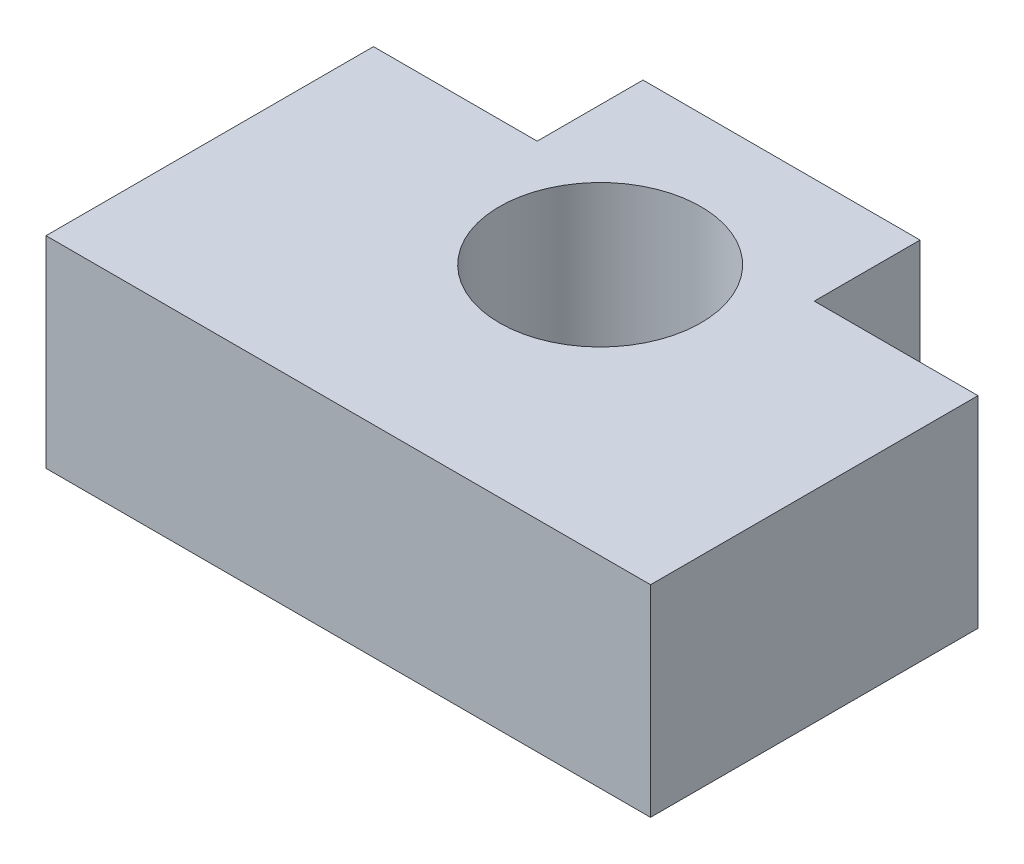
ISO-10303-21;
HEADER;
FILE_DESCRIPTION(('STEP AP214'),'2;1');
FILE_NAME('part.step','',(''),(''),'','','');
FILE_SCHEMA(('AUTOMOTIVE_DESIGN { 1 0 10303 214 1 1 1 1 }'));
ENDSEC;
DATA;
#1=APPLICATION_CONTEXT('core data for automotive mechanical design processes');
#2=APPLICATION_PROTOCOL_DEFINITION('international standard','automotive_design',2000,#1);
#3=PRODUCT_CONTEXT('',#1,'mechanical');
#4=PRODUCT('Part','Part','',(#3));
#5=PRODUCT_RELATED_PRODUCT_CATEGORY('part','',(#4));
#6=PRODUCT_DEFINITION_FORMATION('','',#4);
#7=PRODUCT_DEFINITION_CONTEXT('part definition',#1,'design');
#8=PRODUCT_DEFINITION('design','',#6,#7);
#9=PRODUCT_DEFINITION_SHAPE('','',#8);
#10=(LENGTH_UNIT() NAMED_UNIT(*) SI_UNIT(.MILLI.,.METRE.));
#11=(NAMED_UNIT(*) PLANE_ANGLE_UNIT() SI_UNIT($,.RADIAN.));
#12=(NAMED_UNIT(*) SI_UNIT($,.STERADIAN.) SOLID_ANGLE_UNIT());
#13=UNCERTAINTY_MEASURE_WITH_UNIT(LENGTH_MEASURE(1.E-05),#10,'distance_accuracy_value','');
#14=(GEOMETRIC_REPRESENTATION_CONTEXT(3) GLOBAL_UNCERTAINTY_ASSIGNED_CONTEXT((#13)) GLOBAL_UNIT_ASSIGNED_CONTEXT((#10,
#11,#12)) REPRESENTATION_CONTEXT('',''));
#15=CARTESIAN_POINT('',(0.,0.,0.));
#16=DIRECTION('',(0.,0.,1.));
#17=DIRECTION('',(1.,0.,0.));
#18=AXIS2_PLACEMENT_3D('',#15,#16,#17);
#19=CARTESIAN_POINT('',(60.,20.,0.));
#20=DIRECTION('',(0.,0.,-1.));
#21=DIRECTION('',(-1.,0.,0.));
#22=AXIS2_PLACEMENT_3D('',#19,#20,#21);
#23=PLANE('',#22);
#24=DIRECTION('',(1.,0.,0.));
#25=VECTOR('',#24,1.);
#26=CARTESIAN_POINT('',(60.,0.,0.));
#27=LINE('',#26,#25);
#28=CARTESIAN_POINT('',(0.,0.,0.));
#29=VERTEX_POINT('',#28);
#30=CARTESIAN_POINT('',(60.,0.,0.));
#31=VERTEX_POINT('',#30);
#32=EDGE_CURVE('E137',#29,#31,#27,.T.);
#33=ORIENTED_EDGE('',*,*,#32,.T.);
#34=DIRECTION('',(0.,-1.,0.));
#35=VECTOR('',#34,1.);
#36=CARTESIAN_POINT('',(60.,20.,0.));
#37=LINE('',#36,#35);
#38=CARTESIAN_POINT('',(60.,20.,0.));
#39=VERTEX_POINT('',#38);
#40=EDGE_CURVE('E11',#39,#31,#37,.T.);
#41=ORIENTED_EDGE('',*,*,#40,.F.);
#42=DIRECTION('',(1.,0.,0.));
#43=VECTOR('',#42,1.);
#44=CARTESIAN_POINT('',(60.,20.,0.));
#45=LINE('',#44,#43);
#46=CARTESIAN_POINT('',(0.,20.,0.));
#47=VERTEX_POINT('',#46);
#48=EDGE_CURVE('E152',#47,#39,#45,.T.);
#49=ORIENTED_EDGE('',*,*,#48,.F.);
#50=DIRECTION('',(0.,-1.,0.));
#51=VECTOR('',#50,1.);
#52=CARTESIAN_POINT('',(0.,20.,0.));
#53=LINE('',#52,#51);
#54=EDGE_CURVE('E133',#47,#29,#53,.T.);
#55=ORIENTED_EDGE('',*,*,#54,.T.);
#56=EDGE_LOOP('',(#33,#41,#49,#55));
#57=FACE_BOUND('',#56,.T.);
#58=ADVANCED_FACE('F41',(#57),#23,.F.);
#59=CARTESIAN_POINT('',(60.,20.,0.));
#60=DIRECTION('',(-1.,0.,0.));
#61=DIRECTION('',(0.,0.,1.));
#62=AXIS2_PLACEMENT_3D('',#59,#60,#61);
#63=PLANE('',#62);
#64=DIRECTION('',(0.,0.,-1.));
#65=VECTOR('',#64,1.);
#66=CARTESIAN_POINT('',(60.,0.,0.));
#67=LINE('',#66,#65);
#68=CARTESIAN_POINT('',(60.,0.,-32.5));
#69=VERTEX_POINT('',#68);
#70=EDGE_CURVE('E140',#31,#69,#67,.T.);
#71=ORIENTED_EDGE('',*,*,#70,.T.);
#72=DIRECTION('',(0.,-1.,0.));
#73=VECTOR('',#72,1.);
#74=CARTESIAN_POINT('',(60.,20.,-32.5));
#75=LINE('',#74,#73);
#76=CARTESIAN_POINT('',(60.,20.,-32.5));
#77=VERTEX_POINT('',#76);
#78=EDGE_CURVE('E49',#77,#69,#75,.T.);
#79=ORIENTED_EDGE('',*,*,#78,.F.);
#80=DIRECTION('',(0.,0.,-1.));
#81=VECTOR('',#80,1.);
#82=CARTESIAN_POINT('',(60.,20.,0.));
#83=LINE('',#82,#81);
#84=EDGE_CURVE('E100',#39,#77,#83,.T.);
#85=ORIENTED_EDGE('',*,*,#84,.F.);
#86=ORIENTED_EDGE('',*,*,#40,.T.);
#87=EDGE_LOOP('',(#71,#79,#85,#86));
#88=FACE_BOUND('',#87,.T.);
#89=ADVANCED_FACE('F208',(#88),#63,.F.);
#90=CARTESIAN_POINT('',(60.,20.,-32.5));
#91=DIRECTION('',(0.,0.,1.));
#92=DIRECTION('',(1.,0.,0.));
#93=AXIS2_PLACEMENT_3D('',#90,#91,#92);
#94=PLANE('',#93);
#95=DIRECTION('',(-1.,0.,0.));
#96=VECTOR('',#95,1.);
#97=CARTESIAN_POINT('',(60.,0.,-32.5));
#98=LINE('',#97,#96);
#99=CARTESIAN_POINT('',(43.75,0.,-32.5));
#100=VERTEX_POINT('',#99);
#101=EDGE_CURVE('E143',#69,#100,#98,.T.);
#102=ORIENTED_EDGE('',*,*,#101,.T.);
#103=DIRECTION('',(0.,-1.,0.));
#104=VECTOR('',#103,1.);
#105=CARTESIAN_POINT('',(43.75,20.,-32.5));
#106=LINE('',#105,#104);
#107=CARTESIAN_POINT('',(43.75,20.,-32.5));
#108=VERTEX_POINT('',#107);
#109=EDGE_CURVE('E159',#108,#100,#106,.T.);
#110=ORIENTED_EDGE('',*,*,#109,.F.);
#111=DIRECTION('',(-1.,0.,0.));
#112=VECTOR('',#111,1.);
#113=CARTESIAN_POINT('',(60.,20.,-32.5));
#114=LINE('',#113,#112);
#115=EDGE_CURVE('E167',#77,#108,#114,.T.);
#116=ORIENTED_EDGE('',*,*,#115,.F.);
#117=ORIENTED_EDGE('',*,*,#78,.T.);
#118=EDGE_LOOP('',(#102,#110,#116,#117));
#119=FACE_BOUND('',#118,.T.);
#120=ADVANCED_FACE('F165',(#119),#94,.F.);
#121=CARTESIAN_POINT('',(43.75,20.,-43.));
#122=DIRECTION('',(-1.,0.,0.));
#123=DIRECTION('',(0.,0.,1.));
#124=AXIS2_PLACEMENT_3D('',#121,#122,#123);
#125=PLANE('',#124);
#126=DIRECTION('',(0.,0.,-1.));
#127=VECTOR('',#126,1.);
#128=CARTESIAN_POINT('',(43.75,0.,-43.));
#129=LINE('',#128,#127);
#130=CARTESIAN_POINT('',(43.75,0.,-43.));
#131=VERTEX_POINT('',#130);
#132=EDGE_CURVE('E145',#100,#131,#129,.T.);
#133=ORIENTED_EDGE('',*,*,#132,.T.);
#134=DIRECTION('',(0.,-1.,0.));
#135=VECTOR('',#134,1.);
#136=CARTESIAN_POINT('',(43.75,20.,-43.));
#137=LINE('',#136,#135);
#138=CARTESIAN_POINT('',(43.75,20.,-43.));
#139=VERTEX_POINT('',#138);
#140=EDGE_CURVE('E156',#139,#131,#137,.T.);
#141=ORIENTED_EDGE('',*,*,#140,.F.);
#142=DIRECTION('',(0.,0.,-1.));
#143=VECTOR('',#142,1.);
#144=CARTESIAN_POINT('',(43.75,20.,-43.));
#145=LINE('',#144,#143);
#146=EDGE_CURVE('E179',#108,#139,#145,.T.);
#147=ORIENTED_EDGE('',*,*,#146,.F.);
#148=ORIENTED_EDGE('',*,*,#109,.T.);
#149=EDGE_LOOP('',(#133,#141,#147,#148));
#150=FACE_BOUND('',#149,.T.);
#151=ADVANCED_FACE('F175',(#150),#125,.F.);
#152=CARTESIAN_POINT('',(16.25,20.,-43.));
#153=DIRECTION('',(0.,0.,1.));
#154=DIRECTION('',(1.,0.,0.));
#155=AXIS2_PLACEMENT_3D('',#152,#153,#154);
#156=PLANE('',#155);
#157=DIRECTION('',(-1.,0.,0.));
#158=VECTOR('',#157,1.);
#159=CARTESIAN_POINT('',(16.25,0.,-43.));
#160=LINE('',#159,#158);
#161=CARTESIAN_POINT('',(16.25,0.,-43.));
#162=VERTEX_POINT('',#161);
#163=EDGE_CURVE('E147',#131,#162,#160,.T.);
#164=ORIENTED_EDGE('',*,*,#163,.T.);
#165=DIRECTION('',(0.,-1.,0.));
#166=VECTOR('',#165,1.);
#167=CARTESIAN_POINT('',(16.25,20.,-43.));
#168=LINE('',#167,#166);
#169=CARTESIAN_POINT('',(16.25,20.,-43.));
#170=VERTEX_POINT('',#169);
#171=EDGE_CURVE('E128',#170,#162,#168,.T.);
#172=ORIENTED_EDGE('',*,*,#171,.F.);
#173=DIRECTION('',(-1.,0.,0.));
#174=VECTOR('',#173,1.);
#175=CARTESIAN_POINT('',(16.25,20.,-43.));
#176=LINE('',#175,#174);
#177=EDGE_CURVE('E119',#139,#170,#176,.T.);
#178=ORIENTED_EDGE('',*,*,#177,.F.);
#179=ORIENTED_EDGE('',*,*,#140,.T.);
#180=EDGE_LOOP('',(#164,#172,#178,#179));
#181=FACE_BOUND('',#180,.T.);
#182=ADVANCED_FACE('F178',(#181),#156,.F.);
#183=CARTESIAN_POINT('',(16.25,20.,-43.));
#184=DIRECTION('',(1.,0.,0.));
#185=DIRECTION('',(0.,0.,-1.));
#186=AXIS2_PLACEMENT_3D('',#183,#184,#185);
#187=PLANE('',#186);
#188=DIRECTION('',(0.,0.,1.));
#189=VECTOR('',#188,1.);
#190=CARTESIAN_POINT('',(16.25,0.,-43.));
#191=LINE('',#190,#189);
#192=CARTESIAN_POINT('',(16.25,0.,-32.5));
#193=VERTEX_POINT('',#192);
#194=EDGE_CURVE('E127',#162,#193,#191,.T.);
#195=ORIENTED_EDGE('',*,*,#194,.T.);
#196=DIRECTION('',(0.,-1.,0.));
#197=VECTOR('',#196,1.);
#198=CARTESIAN_POINT('',(16.25,20.,-32.5));
#199=LINE('',#198,#197);
#200=CARTESIAN_POINT('',(16.25,20.,-32.5));
#201=VERTEX_POINT('',#200);
#202=EDGE_CURVE('E124',#201,#193,#199,.T.);
#203=ORIENTED_EDGE('',*,*,#202,.F.);
#204=DIRECTION('',(0.,0.,1.));
#205=VECTOR('',#204,1.);
#206=CARTESIAN_POINT('',(16.25,20.,-43.));
#207=LINE('',#206,#205);
#208=EDGE_CURVE('E113',#170,#201,#207,.T.);
#209=ORIENTED_EDGE('',*,*,#208,.F.);
#210=ORIENTED_EDGE('',*,*,#171,.T.);
#211=EDGE_LOOP('',(#195,#203,#209,#210));
#212=FACE_BOUND('',#211,.T.);
#213=ADVANCED_FACE('F125',(#212),#187,.F.);
#214=CARTESIAN_POINT('',(0.,20.,-32.5));
#215=DIRECTION('',(0.,0.,1.));
#216=DIRECTION('',(1.,0.,0.));
#217=AXIS2_PLACEMENT_3D('',#214,#215,#216);
#218=PLANE('',#217);
#219=DIRECTION('',(-1.,0.,0.));
#220=VECTOR('',#219,1.);
#221=CARTESIAN_POINT('',(0.,0.,-32.5));
#222=LINE('',#221,#220);
#223=CARTESIAN_POINT('',(0.,0.,-32.5));
#224=VERTEX_POINT('',#223);
#225=EDGE_CURVE('E86',#193,#224,#222,.T.);
#226=ORIENTED_EDGE('',*,*,#225,.T.);
#227=DIRECTION('',(0.,-1.,0.));
#228=VECTOR('',#227,1.);
#229=CARTESIAN_POINT('',(0.,20.,-32.5));
#230=LINE('',#229,#228);
#231=CARTESIAN_POINT('',(0.,20.,-32.5));
#232=VERTEX_POINT('',#231);
#233=EDGE_CURVE('E129',#232,#224,#230,.T.);
#234=ORIENTED_EDGE('',*,*,#233,.F.);
#235=DIRECTION('',(-1.,0.,0.));
#236=VECTOR('',#235,1.);
#237=CARTESIAN_POINT('',(0.,20.,-32.5));
#238=LINE('',#237,#236);
#239=EDGE_CURVE('E117',#201,#232,#238,.T.);
#240=ORIENTED_EDGE('',*,*,#239,.F.);
#241=ORIENTED_EDGE('',*,*,#202,.T.);
#242=EDGE_LOOP('',(#226,#234,#240,#241));
#243=FACE_BOUND('',#242,.T.);
#244=ADVANCED_FACE('F131',(#243),#218,.F.);
#245=CARTESIAN_POINT('',(0.,20.,-32.5));
#246=DIRECTION('',(1.,0.,0.));
#247=DIRECTION('',(0.,0.,-1.));
#248=AXIS2_PLACEMENT_3D('',#245,#246,#247);
#249=PLANE('',#248);
#250=DIRECTION('',(0.,0.,1.));
#251=VECTOR('',#250,1.);
#252=CARTESIAN_POINT('',(0.,0.,-32.5));
#253=LINE('',#252,#251);
#254=EDGE_CURVE('E92',#224,#29,#253,.T.);
#255=ORIENTED_EDGE('',*,*,#254,.T.);
#256=ORIENTED_EDGE('',*,*,#54,.F.);
#257=DIRECTION('',(0.,0.,1.));
#258=VECTOR('',#257,1.);
#259=CARTESIAN_POINT('',(0.,20.,-32.5));
#260=LINE('',#259,#258);
#261=EDGE_CURVE('E57',#232,#47,#260,.T.);
#262=ORIENTED_EDGE('',*,*,#261,.F.);
#263=ORIENTED_EDGE('',*,*,#233,.T.);
#264=EDGE_LOOP('',(#255,#256,#262,#263));
#265=FACE_BOUND('',#264,.T.);
#266=ADVANCED_FACE('F199',(#265),#249,.F.);
#267=CARTESIAN_POINT('',(0.,20.,0.));
#268=DIRECTION('',(0.,1.,0.));
#269=DIRECTION('',(0.,0.,1.));
#270=AXIS2_PLACEMENT_3D('',#267,#268,#269);
#271=PLANE('',#270);
#272=CARTESIAN_POINT('',(30.,20.,-25.));
#273=DIRECTION('',(0.,1.,0.));
#274=DIRECTION('',(0.,0.,1.));
#275=AXIS2_PLACEMENT_3D('',#272,#273,#274);
#276=CIRCLE('',#275,10.);
#277=CARTESIAN_POINT('',(30.,20.,-15.));
#278=VERTEX_POINT('',#277);
#279=EDGE_CURVE('E185',#278,#278,#276,.T.);
#280=ORIENTED_EDGE('',*,*,#279,.F.);
#281=EDGE_LOOP('',(#280));
#282=FACE_BOUND('',#281,.T.);
#283=ORIENTED_EDGE('',*,*,#48,.T.);
#284=ORIENTED_EDGE('',*,*,#84,.T.);
#285=ORIENTED_EDGE('',*,*,#115,.T.);
#286=ORIENTED_EDGE('',*,*,#146,.T.);
#287=ORIENTED_EDGE('',*,*,#177,.T.);
#288=ORIENTED_EDGE('',*,*,#208,.T.);
#289=ORIENTED_EDGE('',*,*,#239,.T.);
#290=ORIENTED_EDGE('',*,*,#261,.T.);
#291=EDGE_LOOP('',(#283,#284,#285,#286,#287,#288,#289,#290));
#292=FACE_BOUND('',#291,.T.);
#293=ADVANCED_FACE('F115',(#282,#292),#271,.T.);
#294=CARTESIAN_POINT('',(0.,0.,0.));
#295=DIRECTION('',(0.,1.,0.));
#296=DIRECTION('',(0.,0.,1.));
#297=AXIS2_PLACEMENT_3D('',#294,#295,#296);
#298=PLANE('',#297);
#299=CARTESIAN_POINT('',(30.,0.,-25.));
#300=DIRECTION('',(0.,1.,0.));
#301=DIRECTION('',(0.,0.,1.));
#302=AXIS2_PLACEMENT_3D('',#299,#300,#301);
#303=CIRCLE('',#302,10.);
#304=CARTESIAN_POINT('',(30.,0.,-15.));
#305=VERTEX_POINT('',#304);
#306=EDGE_CURVE('E141',#305,#305,#303,.T.);
#307=ORIENTED_EDGE('',*,*,#306,.T.);
#308=EDGE_LOOP('',(#307));
#309=FACE_BOUND('',#308,.T.);
#310=ORIENTED_EDGE('',*,*,#32,.F.);
#311=ORIENTED_EDGE('',*,*,#254,.F.);
#312=ORIENTED_EDGE('',*,*,#225,.F.);
#313=ORIENTED_EDGE('',*,*,#194,.F.);
#314=ORIENTED_EDGE('',*,*,#163,.F.);
#315=ORIENTED_EDGE('',*,*,#132,.F.);
#316=ORIENTED_EDGE('',*,*,#101,.F.);
#317=ORIENTED_EDGE('',*,*,#70,.F.);
#318=EDGE_LOOP('',(#310,#311,#312,#313,#314,#315,#316,#317));
#319=FACE_BOUND('',#318,.T.);
#320=ADVANCED_FACE('F171',(#309,#319),#298,.F.);
#321=CARTESIAN_POINT('',(30.,0.,-25.));
#322=DIRECTION('',(0.,1.,0.));
#323=DIRECTION('',(0.,0.,1.));
#324=AXIS2_PLACEMENT_3D('',#321,#322,#323);
#325=CYLINDRICAL_SURFACE('',#324,10.);
#326=ORIENTED_EDGE('',*,*,#306,.F.);
#327=EDGE_LOOP('',(#326));
#328=FACE_BOUND('',#327,.T.);
#329=ORIENTED_EDGE('',*,*,#279,.T.);
#330=EDGE_LOOP('',(#329));
#331=FACE_BOUND('',#330,.T.);
#332=ADVANCED_FACE('F192',(#328,#331),#325,.F.);
#333=CLOSED_SHELL('',(#58,#89,#120,#151,#182,#213,#244,#266,#293,#320,#332));
#334=MANIFOLD_SOLID_BREP('B2',#333);
#335=ADVANCED_BREP_SHAPE_REPRESENTATION('',(#18,#334),#14);
#336=SHAPE_DEFINITION_REPRESENTATION(#9,#335);
ENDSEC;
END-ISO-10303-21;
